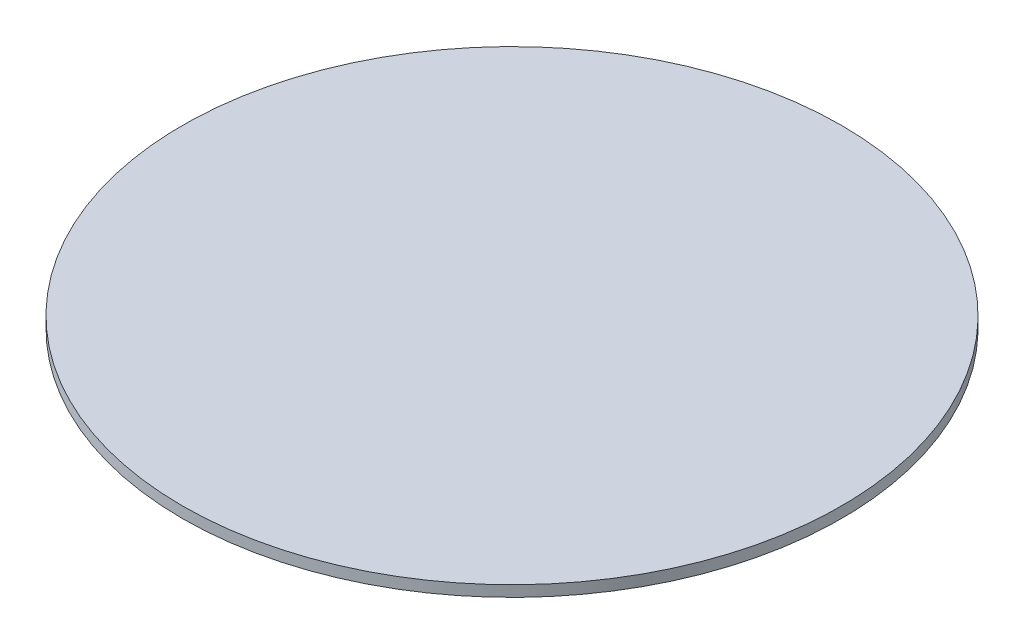
ISO-10303-21;
HEADER;
FILE_DESCRIPTION(('STEP AP214'),'2;1');
FILE_NAME('part.step','',(''),(''),'','','');
FILE_SCHEMA(('AUTOMOTIVE_DESIGN { 1 0 10303 214 1 1 1 1 }'));
ENDSEC;
DATA;
#1=APPLICATION_CONTEXT('core data for automotive mechanical design processes');
#2=APPLICATION_PROTOCOL_DEFINITION('international standard','automotive_design',2000,#1);
#3=PRODUCT_CONTEXT('',#1,'mechanical');
#4=PRODUCT('Part','Part','',(#3));
#5=PRODUCT_RELATED_PRODUCT_CATEGORY('part','',(#4));
#6=PRODUCT_DEFINITION_FORMATION('','',#4);
#7=PRODUCT_DEFINITION_CONTEXT('part definition',#1,'design');
#8=PRODUCT_DEFINITION('design','',#6,#7);
#9=PRODUCT_DEFINITION_SHAPE('','',#8);
#10=(LENGTH_UNIT() NAMED_UNIT(*) SI_UNIT(.MILLI.,.METRE.));
#11=(NAMED_UNIT(*) PLANE_ANGLE_UNIT() SI_UNIT($,.RADIAN.));
#12=(NAMED_UNIT(*) SI_UNIT($,.STERADIAN.) SOLID_ANGLE_UNIT());
#13=UNCERTAINTY_MEASURE_WITH_UNIT(LENGTH_MEASURE(1.E-05),#10,'distance_accuracy_value','');
#14=(GEOMETRIC_REPRESENTATION_CONTEXT(3) GLOBAL_UNCERTAINTY_ASSIGNED_CONTEXT((#13)) GLOBAL_UNIT_ASSIGNED_CONTEXT((#10,
#11,#12)) REPRESENTATION_CONTEXT('',''));
#15=CARTESIAN_POINT('',(0.,0.,0.));
#16=DIRECTION('',(0.,0.,1.));
#17=DIRECTION('',(1.,0.,0.));
#18=AXIS2_PLACEMENT_3D('',#15,#16,#17);
#19=CARTESIAN_POINT('',(0.,0.3,0.));
#20=DIRECTION('',(0.,-1.,0.));
#21=DIRECTION('',(0.,0.,-1.));
#22=AXIS2_PLACEMENT_3D('',#19,#20,#21);
#23=CYLINDRICAL_SURFACE('',#22,9.);
#24=CARTESIAN_POINT('',(0.,0.3,0.));
#25=DIRECTION('',(0.,1.,0.));
#26=DIRECTION('',(0.,0.,1.));
#27=AXIS2_PLACEMENT_3D('',#24,#25,#26);
#28=CIRCLE('',#27,9.);
#29=CARTESIAN_POINT('',(0.,0.3,9.));
#30=VERTEX_POINT('',#29);
#31=EDGE_CURVE('E10',#30,#30,#28,.T.);
#32=ORIENTED_EDGE('',*,*,#31,.F.);
#33=EDGE_LOOP('',(#32));
#34=FACE_BOUND('',#33,.T.);
#35=CARTESIAN_POINT('',(0.,0.,0.));
#36=DIRECTION('',(0.,1.,0.));
#37=DIRECTION('',(0.,0.,1.));
#38=AXIS2_PLACEMENT_3D('',#35,#36,#37);
#39=CIRCLE('',#38,9.);
#40=CARTESIAN_POINT('',(0.,0.,9.));
#41=VERTEX_POINT('',#40);
#42=EDGE_CURVE('E36',#41,#41,#39,.T.);
#43=ORIENTED_EDGE('',*,*,#42,.T.);
#44=EDGE_LOOP('',(#43));
#45=FACE_BOUND('',#44,.T.);
#46=ADVANCED_FACE('F33',(#34,#45),#23,.T.);
#47=CARTESIAN_POINT('',(0.,0.3,0.));
#48=DIRECTION('',(0.,1.,0.));
#49=DIRECTION('',(0.,0.,1.));
#50=AXIS2_PLACEMENT_3D('',#47,#48,#49);
#51=PLANE('',#50);
#52=ORIENTED_EDGE('',*,*,#31,.T.);
#53=EDGE_LOOP('',(#52));
#54=FACE_BOUND('',#53,.T.);
#55=ADVANCED_FACE('F48',(#54),#51,.T.);
#56=CARTESIAN_POINT('',(0.,0.,0.));
#57=DIRECTION('',(0.,1.,0.));
#58=DIRECTION('',(0.,0.,1.));
#59=AXIS2_PLACEMENT_3D('',#56,#57,#58);
#60=PLANE('',#59);
#61=ORIENTED_EDGE('',*,*,#42,.F.);
#62=EDGE_LOOP('',(#61));
#63=FACE_BOUND('',#62,.T.);
#64=ADVANCED_FACE('F46',(#63),#60,.F.);
#65=CLOSED_SHELL('',(#46,#55,#64));
#66=MANIFOLD_SOLID_BREP('B2',#65);
#67=ADVANCED_BREP_SHAPE_REPRESENTATION('',(#18,#66),#14);
#68=SHAPE_DEFINITION_REPRESENTATION(#9,#67);
ENDSEC;
END-ISO-10303-21;
